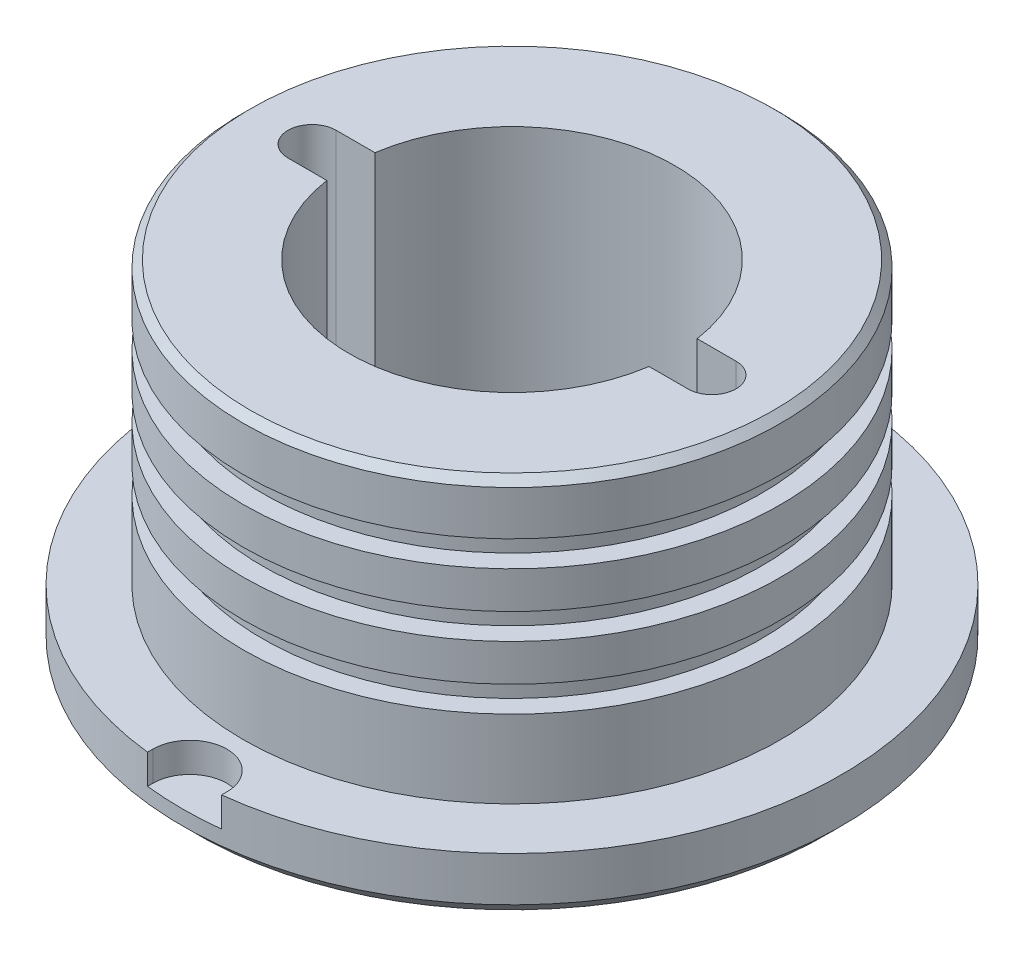
ISO-10303-21;
HEADER;
FILE_DESCRIPTION(('STEP AP214'),'2;1');
FILE_NAME('part.step','',(''),(''),'','','');
FILE_SCHEMA(('AUTOMOTIVE_DESIGN { 1 0 10303 214 1 1 1 1 }'));
ENDSEC;
DATA;
#1=APPLICATION_CONTEXT('core data for automotive mechanical design processes');
#2=APPLICATION_PROTOCOL_DEFINITION('international standard','automotive_design',2000,#1);
#3=PRODUCT_CONTEXT('',#1,'mechanical');
#4=PRODUCT('Part','Part','',(#3));
#5=PRODUCT_RELATED_PRODUCT_CATEGORY('part','',(#4));
#6=PRODUCT_DEFINITION_FORMATION('','',#4);
#7=PRODUCT_DEFINITION_CONTEXT('part definition',#1,'design');
#8=PRODUCT_DEFINITION('design','',#6,#7);
#9=PRODUCT_DEFINITION_SHAPE('','',#8);
#10=(LENGTH_UNIT() NAMED_UNIT(*) SI_UNIT(.MILLI.,.METRE.));
#11=(NAMED_UNIT(*) PLANE_ANGLE_UNIT() SI_UNIT($,.RADIAN.));
#12=(NAMED_UNIT(*) SI_UNIT($,.STERADIAN.) SOLID_ANGLE_UNIT());
#13=UNCERTAINTY_MEASURE_WITH_UNIT(LENGTH_MEASURE(1.E-05),#10,'distance_accuracy_value','');
#14=(GEOMETRIC_REPRESENTATION_CONTEXT(3) GLOBAL_UNCERTAINTY_ASSIGNED_CONTEXT((#13)) GLOBAL_UNIT_ASSIGNED_CONTEXT((#10,
#11,#12)) REPRESENTATION_CONTEXT('',''));
#15=CARTESIAN_POINT('',(0.,0.,0.));
#16=DIRECTION('',(0.,0.,1.));
#17=DIRECTION('',(1.,0.,0.));
#18=AXIS2_PLACEMENT_3D('',#15,#16,#17);
#19=CARTESIAN_POINT('',(0.,0.,0.));
#20=DIRECTION('',(0.,-1.,0.));
#21=DIRECTION('',(0.,0.,-1.));
#22=AXIS2_PLACEMENT_3D('',#19,#20,#21);
#23=CYLINDRICAL_SURFACE('',#22,22.);
#24=CARTESIAN_POINT('',(0.,46.,0.));
#25=DIRECTION('',(0.,-1.,0.));
#26=DIRECTION('',(0.,0.,-1.));
#27=AXIS2_PLACEMENT_3D('',#24,#25,#26);
#28=CIRCLE('',#27,22.);
#29=CARTESIAN_POINT('',(-21.7586189819115,46.,-3.25));
#30=VERTEX_POINT('',#29);
#31=CARTESIAN_POINT('',(21.7586189819115,46.,-3.25));
#32=VERTEX_POINT('',#31);
#33=EDGE_CURVE('E380',#30,#32,#28,.T.);
#34=ORIENTED_EDGE('',*,*,#33,.F.);
#35=DIRECTION('',(0.,-1.,0.));
#36=VECTOR('',#35,1.);
#37=CARTESIAN_POINT('',(-21.7586189819115,0.,-3.25));
#38=LINE('',#37,#36);
#39=CARTESIAN_POINT('',(-21.7586189819115,12.0000000000002,-3.25));
#40=VERTEX_POINT('',#39);
#41=EDGE_CURVE('E239',#30,#40,#38,.T.);
#42=ORIENTED_EDGE('',*,*,#41,.T.);
#43=CARTESIAN_POINT('',(0.,12.0000000000002,0.));
#44=DIRECTION('',(0.,-1.,0.));
#45=DIRECTION('',(0.,0.,-1.));
#46=AXIS2_PLACEMENT_3D('',#43,#44,#45);
#47=CIRCLE('',#46,22.);
#48=CARTESIAN_POINT('',(21.7586189819115,12.0000000000002,-3.25));
#49=VERTEX_POINT('',#48);
#50=EDGE_CURVE('E375',#40,#49,#47,.T.);
#51=ORIENTED_EDGE('',*,*,#50,.T.);
#52=DIRECTION('',(0.,-1.,0.));
#53=VECTOR('',#52,1.);
#54=CARTESIAN_POINT('',(21.7586189819115,0.,-3.25));
#55=LINE('',#54,#53);
#56=EDGE_CURVE('E236',#32,#49,#55,.T.);
#57=ORIENTED_EDGE('',*,*,#56,.F.);
#58=EDGE_LOOP('',(#34,#42,#51,#57));
#59=FACE_BOUND('',#58,.T.);
#60=ADVANCED_FACE('F45',(#59),#23,.F.);
#61=CARTESIAN_POINT('',(0.,0.,0.));
#62=DIRECTION('',(0.,-1.,0.));
#63=DIRECTION('',(0.,0.,-1.));
#64=AXIS2_PLACEMENT_3D('',#61,#62,#63);
#65=PLANE('',#64);
#66=CARTESIAN_POINT('',(0.,0.,-13.));
#67=DIRECTION('',(0.,-1.,0.));
#68=DIRECTION('',(0.,0.,-1.));
#69=AXIS2_PLACEMENT_3D('',#66,#67,#68);
#70=CIRCLE('',#69,4.);
#71=CARTESIAN_POINT('',(0.,0.,-17.));
#72=VERTEX_POINT('',#71);
#73=EDGE_CURVE('E902',#72,#72,#70,.T.);
#74=ORIENTED_EDGE('',*,*,#73,.F.);
#75=EDGE_LOOP('',(#74));
#76=FACE_BOUND('',#75,.T.);
#77=CARTESIAN_POINT('',(-8.49999999999999,0.,7.));
#78=DIRECTION('',(0.,-1.,0.));
#79=DIRECTION('',(0.,0.,-1.));
#80=AXIS2_PLACEMENT_3D('',#77,#78,#79);
#81=CIRCLE('',#80,1.25);
#82=CARTESIAN_POINT('',(-8.49999999999999,0.,5.75));
#83=VERTEX_POINT('',#82);
#84=EDGE_CURVE('E914',#83,#83,#81,.T.);
#85=ORIENTED_EDGE('',*,*,#84,.F.);
#86=EDGE_LOOP('',(#85));
#87=FACE_BOUND('',#86,.T.);
#88=CARTESIAN_POINT('',(8.50000000000001,0.,7.));
#89=DIRECTION('',(0.,-1.,0.));
#90=DIRECTION('',(0.,0.,-1.));
#91=AXIS2_PLACEMENT_3D('',#88,#89,#90);
#92=CIRCLE('',#91,1.25);
#93=CARTESIAN_POINT('',(8.50000000000001,0.,5.75));
#94=VERTEX_POINT('',#93);
#95=EDGE_CURVE('E194',#94,#94,#92,.T.);
#96=ORIENTED_EDGE('',*,*,#95,.F.);
#97=EDGE_LOOP('',(#96));
#98=FACE_BOUND('',#97,.T.);
#99=CARTESIAN_POINT('',(0.,0.,0.));
#100=DIRECTION('',(0.,-1.,0.));
#101=DIRECTION('',(0.,0.,-1.));
#102=AXIS2_PLACEMENT_3D('',#99,#100,#101);
#103=CIRCLE('',#102,42.5);
#104=CARTESIAN_POINT('',(0.,0.,-42.5));
#105=VERTEX_POINT('',#104);
#106=EDGE_CURVE('E55',#105,#105,#103,.T.);
#107=ORIENTED_EDGE('',*,*,#106,.T.);
#108=EDGE_LOOP('',(#107));
#109=FACE_BOUND('',#108,.T.);
#110=CARTESIAN_POINT('',(27.,0.,0.));
#111=DIRECTION('',(0.,-1.,0.));
#112=DIRECTION('',(0.,0.,-1.));
#113=AXIS2_PLACEMENT_3D('',#110,#111,#112);
#114=CIRCLE('',#113,1.5);
#115=CARTESIAN_POINT('',(27.,0.,-1.5));
#116=VERTEX_POINT('',#115);
#117=EDGE_CURVE('E251',#116,#116,#114,.F.);
#118=ORIENTED_EDGE('',*,*,#117,.T.);
#119=EDGE_LOOP('',(#118));
#120=FACE_BOUND('',#119,.T.);
#121=CARTESIAN_POINT('',(-27.,0.,0.));
#122=DIRECTION('',(0.,-1.,0.));
#123=DIRECTION('',(0.,0.,-1.));
#124=AXIS2_PLACEMENT_3D('',#121,#122,#123);
#125=CIRCLE('',#124,1.5);
#126=CARTESIAN_POINT('',(-27.,0.,-1.5));
#127=VERTEX_POINT('',#126);
#128=EDGE_CURVE('E299',#127,#127,#125,.T.);
#129=ORIENTED_EDGE('',*,*,#128,.F.);
#130=EDGE_LOOP('',(#129));
#131=FACE_BOUND('',#130,.T.);
#132=ADVANCED_FACE('F414',(#76,#87,#98,#109,#120,#131),#65,.T.);
#133=CARTESIAN_POINT('',(0.,0.,0.));
#134=DIRECTION('',(0.,-1.,0.));
#135=DIRECTION('',(0.,0.,-1.));
#136=AXIS2_PLACEMENT_3D('',#133,#134,#135);
#137=CYLINDRICAL_SURFACE('',#136,36.3);
#138=CARTESIAN_POINT('',(0.,45.,0.));
#139=DIRECTION('',(0.,1.,0.));
#140=DIRECTION('',(0.,0.,1.));
#141=AXIS2_PLACEMENT_3D('',#138,#139,#140);
#142=CIRCLE('',#141,36.3);
#143=CARTESIAN_POINT('',(0.,45.,36.3));
#144=VERTEX_POINT('',#143);
#145=EDGE_CURVE('E397',#144,#144,#142,.F.);
#146=ORIENTED_EDGE('',*,*,#145,.T.);
#147=EDGE_LOOP('',(#146));
#148=FACE_BOUND('',#147,.T.);
#149=CARTESIAN_POINT('',(0.,39.,0.));
#150=DIRECTION('',(0.,-1.,0.));
#151=DIRECTION('',(0.,0.,-1.));
#152=AXIS2_PLACEMENT_3D('',#149,#150,#151);
#153=CIRCLE('',#152,36.3);
#154=CARTESIAN_POINT('',(0.,39.,-36.3));
#155=VERTEX_POINT('',#154);
#156=EDGE_CURVE('E318',#155,#155,#153,.T.);
#157=ORIENTED_EDGE('',*,*,#156,.F.);
#158=EDGE_LOOP('',(#157));
#159=FACE_BOUND('',#158,.T.);
#160=ADVANCED_FACE('F437',(#148,#159),#137,.T.);
#161=CARTESIAN_POINT('',(36.3,46.,0.));
#162=DIRECTION('',(0.,1.,0.));
#163=DIRECTION('',(0.,0.,1.));
#164=AXIS2_PLACEMENT_3D('',#161,#162,#163);
#165=PLANE('',#164);
#166=DIRECTION('',(-1.,0.,0.));
#167=VECTOR('',#166,1.);
#168=CARTESIAN_POINT('',(22.,46.,3.24999999999997));
#169=LINE('',#168,#167);
#170=CARTESIAN_POINT('',(-21.7586189819115,46.,3.25));
#171=VERTEX_POINT('',#170);
#172=CARTESIAN_POINT('',(-27.,46.,3.25));
#173=VERTEX_POINT('',#172);
#174=EDGE_CURVE('E174',#171,#173,#169,.T.);
#175=ORIENTED_EDGE('',*,*,#174,.T.);
#176=CARTESIAN_POINT('',(-27.,46.,0.));
#177=DIRECTION('',(0.,1.,0.));
#178=DIRECTION('',(0.,0.,1.));
#179=AXIS2_PLACEMENT_3D('',#176,#177,#178);
#180=CIRCLE('',#179,3.25);
#181=CARTESIAN_POINT('',(-27.,46.,-3.25));
#182=VERTEX_POINT('',#181);
#183=EDGE_CURVE('E162',#182,#173,#180,.T.);
#184=ORIENTED_EDGE('',*,*,#183,.F.);
#185=DIRECTION('',(-1.,0.,0.));
#186=VECTOR('',#185,1.);
#187=CARTESIAN_POINT('',(22.,46.,-3.24999999999998));
#188=LINE('',#187,#186);
#189=EDGE_CURVE('E173',#30,#182,#188,.T.);
#190=ORIENTED_EDGE('',*,*,#189,.F.);
#191=ORIENTED_EDGE('',*,*,#33,.T.);
#192=DIRECTION('',(1.,0.,0.));
#193=VECTOR('',#192,1.);
#194=CARTESIAN_POINT('',(22.,46.,-3.25));
#195=LINE('',#194,#193);
#196=CARTESIAN_POINT('',(27.,46.,-3.25));
#197=VERTEX_POINT('',#196);
#198=EDGE_CURVE('E210',#32,#197,#195,.T.);
#199=ORIENTED_EDGE('',*,*,#198,.T.);
#200=CARTESIAN_POINT('',(27.,46.,0.));
#201=DIRECTION('',(0.,1.,0.));
#202=DIRECTION('',(0.,0.,1.));
#203=AXIS2_PLACEMENT_3D('',#200,#201,#202);
#204=CIRCLE('',#203,3.25);
#205=CARTESIAN_POINT('',(27.,46.,3.25));
#206=VERTEX_POINT('',#205);
#207=EDGE_CURVE('E207',#206,#197,#204,.T.);
#208=ORIENTED_EDGE('',*,*,#207,.F.);
#209=DIRECTION('',(1.,0.,0.));
#210=VECTOR('',#209,1.);
#211=CARTESIAN_POINT('',(22.,46.,3.25));
#212=LINE('',#211,#210);
#213=CARTESIAN_POINT('',(21.7586189819115,46.,3.25));
#214=VERTEX_POINT('',#213);
#215=EDGE_CURVE('E215',#214,#206,#212,.T.);
#216=ORIENTED_EDGE('',*,*,#215,.F.);
#217=EDGE_CURVE('E186',#214,#171,#28,.T.);
#218=ORIENTED_EDGE('',*,*,#217,.T.);
#219=EDGE_LOOP('',(#175,#184,#190,#191,#199,#208,#216,#218));
#220=FACE_BOUND('',#219,.T.);
#221=CARTESIAN_POINT('',(0.,46.,0.));
#222=DIRECTION('',(0.,1.,0.));
#223=DIRECTION('',(0.,0.,1.));
#224=AXIS2_PLACEMENT_3D('',#221,#222,#223);
#225=CIRCLE('',#224,35.3);
#226=CARTESIAN_POINT('',(0.,46.,35.3));
#227=VERTEX_POINT('',#226);
#228=EDGE_CURVE('E401',#227,#227,#225,.T.);
#229=ORIENTED_EDGE('',*,*,#228,.T.);
#230=EDGE_LOOP('',(#229));
#231=FACE_BOUND('',#230,.T.);
#232=ADVANCED_FACE('F182',(#220,#231),#165,.T.);
#233=DIRECTION('',(0.,-1.,0.));
#234=VECTOR('',#233,1.);
#235=CARTESIAN_POINT('',(-21.7586189819115,0.,3.25));
#236=LINE('',#235,#234);
#237=CARTESIAN_POINT('',(-21.7586189819115,12.0000000000002,3.25));
#238=VERTEX_POINT('',#237);
#239=EDGE_CURVE('E243',#171,#238,#236,.T.);
#240=ORIENTED_EDGE('',*,*,#239,.F.);
#241=ORIENTED_EDGE('',*,*,#217,.F.);
#242=DIRECTION('',(0.,-1.,0.));
#243=VECTOR('',#242,1.);
#244=CARTESIAN_POINT('',(21.7586189819115,0.,3.25));
#245=LINE('',#244,#243);
#246=CARTESIAN_POINT('',(21.7586189819115,12.0000000000002,3.25));
#247=VERTEX_POINT('',#246);
#248=EDGE_CURVE('E205',#214,#247,#245,.T.);
#249=ORIENTED_EDGE('',*,*,#248,.T.);
#250=EDGE_CURVE('E379',#247,#238,#47,.T.);
#251=ORIENTED_EDGE('',*,*,#250,.T.);
#252=EDGE_LOOP('',(#240,#241,#249,#251));
#253=FACE_BOUND('',#252,.T.);
#254=ADVANCED_FACE('F433',(#253),#23,.F.);
#255=CARTESIAN_POINT('',(22.,12.0000000000002,0.));
#256=DIRECTION('',(0.,1.,0.));
#257=DIRECTION('',(0.,0.,1.));
#258=AXIS2_PLACEMENT_3D('',#255,#256,#257);
#259=PLANE('',#258);
#260=CARTESIAN_POINT('',(0.,12.0000000000002,-13.));
#261=DIRECTION('',(0.,1.,0.));
#262=DIRECTION('',(0.,0.,1.));
#263=AXIS2_PLACEMENT_3D('',#260,#261,#262);
#264=CIRCLE('',#263,4.);
#265=CARTESIAN_POINT('',(0.,12.0000000000002,-9.));
#266=VERTEX_POINT('',#265);
#267=EDGE_CURVE('E899',#266,#266,#264,.F.);
#268=ORIENTED_EDGE('',*,*,#267,.T.);
#269=EDGE_LOOP('',(#268));
#270=FACE_BOUND('',#269,.T.);
#271=ORIENTED_EDGE('',*,*,#50,.F.);
#272=DIRECTION('',(-1.,0.,0.));
#273=VECTOR('',#272,1.);
#274=CARTESIAN_POINT('',(22.,12.0000000000002,-3.24999999999998));
#275=LINE('',#274,#273);
#276=CARTESIAN_POINT('',(-27.,12.0000000000002,-3.25));
#277=VERTEX_POINT('',#276);
#278=EDGE_CURVE('E188',#40,#277,#275,.T.);
#279=ORIENTED_EDGE('',*,*,#278,.T.);
#280=CARTESIAN_POINT('',(-27.,12.0000000000002,0.));
#281=DIRECTION('',(0.,1.,0.));
#282=DIRECTION('',(0.,0.,1.));
#283=AXIS2_PLACEMENT_3D('',#280,#281,#282);
#284=CIRCLE('',#283,3.25);
#285=CARTESIAN_POINT('',(-27.,12.0000000000002,3.25));
#286=VERTEX_POINT('',#285);
#287=EDGE_CURVE('E191',#277,#286,#284,.T.);
#288=ORIENTED_EDGE('',*,*,#287,.T.);
#289=DIRECTION('',(-1.,0.,0.));
#290=VECTOR('',#289,1.);
#291=CARTESIAN_POINT('',(22.,12.0000000000002,3.24999999999997));
#292=LINE('',#291,#290);
#293=EDGE_CURVE('E62',#238,#286,#292,.T.);
#294=ORIENTED_EDGE('',*,*,#293,.F.);
#295=ORIENTED_EDGE('',*,*,#250,.F.);
#296=DIRECTION('',(1.,0.,0.));
#297=VECTOR('',#296,1.);
#298=CARTESIAN_POINT('',(22.,12.0000000000002,3.25));
#299=LINE('',#298,#297);
#300=CARTESIAN_POINT('',(27.,12.0000000000002,3.25));
#301=VERTEX_POINT('',#300);
#302=EDGE_CURVE('E211',#247,#301,#299,.T.);
#303=ORIENTED_EDGE('',*,*,#302,.T.);
#304=CARTESIAN_POINT('',(27.,12.0000000000002,0.));
#305=DIRECTION('',(0.,1.,0.));
#306=DIRECTION('',(0.,0.,1.));
#307=AXIS2_PLACEMENT_3D('',#304,#305,#306);
#308=CIRCLE('',#307,3.25);
#309=CARTESIAN_POINT('',(27.,12.0000000000002,-3.25));
#310=VERTEX_POINT('',#309);
#311=EDGE_CURVE('E219',#301,#310,#308,.T.);
#312=ORIENTED_EDGE('',*,*,#311,.T.);
#313=DIRECTION('',(1.,0.,0.));
#314=VECTOR('',#313,1.);
#315=CARTESIAN_POINT('',(22.,12.0000000000002,-3.25));
#316=LINE('',#315,#314);
#317=EDGE_CURVE('E69',#49,#310,#316,.T.);
#318=ORIENTED_EDGE('',*,*,#317,.F.);
#319=EDGE_LOOP('',(#271,#279,#288,#294,#295,#303,#312,#318));
#320=FACE_BOUND('',#319,.T.);
#321=CARTESIAN_POINT('',(27.,12.0000000000002,0.));
#322=DIRECTION('',(0.,1.,0.));
#323=DIRECTION('',(0.,0.,1.));
#324=AXIS2_PLACEMENT_3D('',#321,#322,#323);
#325=CIRCLE('',#324,1.5);
#326=CARTESIAN_POINT('',(27.,12.0000000000002,1.5));
#327=VERTEX_POINT('',#326);
#328=EDGE_CURVE('E246',#327,#327,#325,.T.);
#329=ORIENTED_EDGE('',*,*,#328,.F.);
#330=EDGE_LOOP('',(#329));
#331=FACE_BOUND('',#330,.T.);
#332=CARTESIAN_POINT('',(-27.,12.0000000000002,0.));
#333=DIRECTION('',(0.,1.,0.));
#334=DIRECTION('',(0.,0.,1.));
#335=AXIS2_PLACEMENT_3D('',#332,#333,#334);
#336=CIRCLE('',#335,1.5);
#337=CARTESIAN_POINT('',(-27.,12.0000000000002,1.5));
#338=VERTEX_POINT('',#337);
#339=EDGE_CURVE('E247',#338,#338,#336,.F.);
#340=ORIENTED_EDGE('',*,*,#339,.T.);
#341=EDGE_LOOP('',(#340));
#342=FACE_BOUND('',#341,.T.);
#343=ADVANCED_FACE('F444',(#270,#320,#331,#342),#259,.T.);
#344=CARTESIAN_POINT('',(0.,0.,0.));
#345=DIRECTION('',(0.,-1.,0.));
#346=DIRECTION('',(0.,0.,-1.));
#347=AXIS2_PLACEMENT_3D('',#344,#345,#346);
#348=CYLINDRICAL_SURFACE('',#347,44.5);
#349=CARTESIAN_POINT('',(0.,1.99999999999997,0.));
#350=DIRECTION('',(0.,-1.,0.));
#351=DIRECTION('',(0.,0.,-1.));
#352=AXIS2_PLACEMENT_3D('',#349,#350,#351);
#353=CIRCLE('',#352,44.5);
#354=CARTESIAN_POINT('',(0.,1.99999999999997,-44.5));
#355=VERTEX_POINT('',#354);
#356=EDGE_CURVE('E11',#355,#355,#353,.F.);
#357=ORIENTED_EDGE('',*,*,#356,.T.);
#358=EDGE_LOOP('',(#357));
#359=FACE_BOUND('',#358,.T.);
#360=DIRECTION('',(0.,-1.,0.));
#361=VECTOR('',#360,1.);
#362=CARTESIAN_POINT('',(4.99999999999996,0.,-44.218208918951));
#363=LINE('',#362,#361);
#364=CARTESIAN_POINT('',(4.99999999999996,8.,-44.218208918951));
#365=VERTEX_POINT('',#364);
#366=CARTESIAN_POINT('',(4.99999999999996,4.,-44.218208918951));
#367=VERTEX_POINT('',#366);
#368=EDGE_CURVE('E315',#365,#367,#363,.T.);
#369=ORIENTED_EDGE('',*,*,#368,.F.);
#370=CARTESIAN_POINT('',(0.,8.,0.));
#371=DIRECTION('',(0.,-1.,0.));
#372=DIRECTION('',(0.,0.,-1.));
#373=AXIS2_PLACEMENT_3D('',#370,#371,#372);
#374=CIRCLE('',#373,44.5);
#375=CARTESIAN_POINT('',(4.99999999999996,8.,44.218208918951));
#376=VERTEX_POINT('',#375);
#377=EDGE_CURVE('E371',#365,#376,#374,.T.);
#378=ORIENTED_EDGE('',*,*,#377,.T.);
#379=DIRECTION('',(0.,-1.,0.));
#380=VECTOR('',#379,1.);
#381=CARTESIAN_POINT('',(4.99999999999996,0.,44.218208918951));
#382=LINE('',#381,#380);
#383=CARTESIAN_POINT('',(4.99999999999996,4.,44.218208918951));
#384=VERTEX_POINT('',#383);
#385=EDGE_CURVE('E278',#384,#376,#382,.F.);
#386=ORIENTED_EDGE('',*,*,#385,.F.);
#387=CARTESIAN_POINT('',(0.,4.,0.));
#388=DIRECTION('',(0.,-1.,0.));
#389=DIRECTION('',(0.,0.,-1.));
#390=AXIS2_PLACEMENT_3D('',#387,#388,#389);
#391=CIRCLE('',#390,44.5);
#392=CARTESIAN_POINT('',(-4.99999999999999,4.,44.218208918951));
#393=VERTEX_POINT('',#392);
#394=EDGE_CURVE('E390',#393,#384,#391,.F.);
#395=ORIENTED_EDGE('',*,*,#394,.F.);
#396=DIRECTION('',(0.,-1.,0.));
#397=VECTOR('',#396,1.);
#398=CARTESIAN_POINT('',(-4.99999999999999,0.,44.218208918951));
#399=LINE('',#398,#397);
#400=CARTESIAN_POINT('',(-4.99999999999999,8.,44.218208918951));
#401=VERTEX_POINT('',#400);
#402=EDGE_CURVE('E309',#401,#393,#399,.T.);
#403=ORIENTED_EDGE('',*,*,#402,.F.);
#404=CARTESIAN_POINT('',(-5.,8.,-44.218208918951));
#405=VERTEX_POINT('',#404);
#406=EDGE_CURVE('E370',#401,#405,#374,.T.);
#407=ORIENTED_EDGE('',*,*,#406,.T.);
#408=DIRECTION('',(0.,-1.,0.));
#409=VECTOR('',#408,1.);
#410=CARTESIAN_POINT('',(-4.99999999999999,0.,-44.218208918951));
#411=LINE('',#410,#409);
#412=CARTESIAN_POINT('',(-4.99999999999999,4.,-44.218208918951));
#413=VERTEX_POINT('',#412);
#414=EDGE_CURVE('E312',#413,#405,#411,.F.);
#415=ORIENTED_EDGE('',*,*,#414,.F.);
#416=CARTESIAN_POINT('',(0.,4.,0.));
#417=DIRECTION('',(0.,1.,0.));
#418=DIRECTION('',(0.,0.,1.));
#419=AXIS2_PLACEMENT_3D('',#416,#417,#418);
#420=CIRCLE('',#419,44.5);
#421=EDGE_CURVE('E393',#413,#367,#420,.F.);
#422=ORIENTED_EDGE('',*,*,#421,.T.);
#423=EDGE_LOOP('',(#369,#378,#386,#395,#403,#407,#415,#422));
#424=FACE_BOUND('',#423,.T.);
#425=ADVANCED_FACE('F450',(#359,#424),#348,.T.);
#426=CARTESIAN_POINT('',(44.5,8.,0.));
#427=DIRECTION('',(0.,1.,0.));
#428=DIRECTION('',(0.,0.,1.));
#429=AXIS2_PLACEMENT_3D('',#426,#427,#428);
#430=PLANE('',#429);
#431=DIRECTION('',(0.,0.,-1.));
#432=VECTOR('',#431,1.);
#433=CARTESIAN_POINT('',(4.99999999999996,8.,-45.5));
#434=LINE('',#433,#432);
#435=CARTESIAN_POINT('',(4.99999999999996,8.,-43.5));
#436=VERTEX_POINT('',#435);
#437=EDGE_CURVE('E259',#436,#365,#434,.T.);
#438=ORIENTED_EDGE('',*,*,#437,.F.);
#439=CARTESIAN_POINT('',(0.,8.,-43.5));
#440=DIRECTION('',(0.,1.,0.));
#441=DIRECTION('',(0.,0.,1.));
#442=AXIS2_PLACEMENT_3D('',#439,#440,#441);
#443=CIRCLE('',#442,4.99999999999998);
#444=CARTESIAN_POINT('',(-5.,8.,-43.5));
#445=VERTEX_POINT('',#444);
#446=EDGE_CURVE('E268',#445,#436,#443,.T.);
#447=ORIENTED_EDGE('',*,*,#446,.F.);
#448=DIRECTION('',(0.,0.,1.));
#449=VECTOR('',#448,1.);
#450=CARTESIAN_POINT('',(-4.99999999999998,8.,0.));
#451=LINE('',#450,#449);
#452=EDGE_CURVE('E387',#405,#445,#451,.T.);
#453=ORIENTED_EDGE('',*,*,#452,.F.);
#454=ORIENTED_EDGE('',*,*,#406,.F.);
#455=DIRECTION('',(0.,0.,1.));
#456=VECTOR('',#455,1.);
#457=CARTESIAN_POINT('',(-5.,8.,45.5));
#458=LINE('',#457,#456);
#459=CARTESIAN_POINT('',(-5.,8.,43.5));
#460=VERTEX_POINT('',#459);
#461=EDGE_CURVE('E286',#460,#401,#458,.T.);
#462=ORIENTED_EDGE('',*,*,#461,.F.);
#463=CARTESIAN_POINT('',(0.,8.,43.5));
#464=DIRECTION('',(0.,1.,0.));
#465=DIRECTION('',(0.,0.,-1.));
#466=AXIS2_PLACEMENT_3D('',#463,#464,#465);
#467=CIRCLE('',#466,4.99999999999998);
#468=CARTESIAN_POINT('',(4.99999999999996,8.,43.5));
#469=VERTEX_POINT('',#468);
#470=EDGE_CURVE('E295',#469,#460,#467,.T.);
#471=ORIENTED_EDGE('',*,*,#470,.F.);
#472=DIRECTION('',(0.,0.,-1.));
#473=VECTOR('',#472,1.);
#474=CARTESIAN_POINT('',(4.99999999999998,8.,0.));
#475=LINE('',#474,#473);
#476=EDGE_CURVE('E384',#376,#469,#475,.T.);
#477=ORIENTED_EDGE('',*,*,#476,.F.);
#478=ORIENTED_EDGE('',*,*,#377,.F.);
#479=EDGE_LOOP('',(#438,#447,#453,#454,#462,#471,#477,#478));
#480=FACE_BOUND('',#479,.T.);
#481=CARTESIAN_POINT('',(0.,8.,0.));
#482=DIRECTION('',(0.,-1.,0.));
#483=DIRECTION('',(0.,0.,-1.));
#484=AXIS2_PLACEMENT_3D('',#481,#482,#483);
#485=CIRCLE('',#484,36.300000000035);
#486=CARTESIAN_POINT('',(0.,8.,-36.300000000035));
#487=VERTEX_POINT('',#486);
#488=EDGE_CURVE('E366',#487,#487,#485,.T.);
#489=ORIENTED_EDGE('',*,*,#488,.T.);
#490=EDGE_LOOP('',(#489));
#491=FACE_BOUND('',#490,.T.);
#492=ADVANCED_FACE('F467',(#480,#491),#430,.T.);
#493=CARTESIAN_POINT('',(0.,0.,0.));
#494=DIRECTION('',(0.,-1.,0.));
#495=DIRECTION('',(0.,0.,-1.));
#496=AXIS2_PLACEMENT_3D('',#493,#494,#495);
#497=CYLINDRICAL_SURFACE('',#496,36.3000000000175);
#498=CARTESIAN_POINT('',(0.,18.5,0.));
#499=DIRECTION('',(0.,-1.,0.));
#500=DIRECTION('',(0.,0.,-1.));
#501=AXIS2_PLACEMENT_3D('',#498,#499,#500);
#502=CIRCLE('',#501,36.3);
#503=CARTESIAN_POINT('',(0.,18.5,-36.3));
#504=VERTEX_POINT('',#503);
#505=EDGE_CURVE('E362',#504,#504,#502,.T.);
#506=ORIENTED_EDGE('',*,*,#505,.T.);
#507=EDGE_LOOP('',(#506));
#508=FACE_BOUND('',#507,.T.);
#509=ORIENTED_EDGE('',*,*,#488,.F.);
#510=EDGE_LOOP('',(#509));
#511=FACE_BOUND('',#510,.T.);
#512=ADVANCED_FACE('F552',(#508,#511),#497,.T.);
#513=CARTESIAN_POINT('',(36.3,18.5,0.));
#514=DIRECTION('',(0.,1.,0.));
#515=DIRECTION('',(0.,0.,1.));
#516=AXIS2_PLACEMENT_3D('',#513,#514,#515);
#517=PLANE('',#516);
#518=CARTESIAN_POINT('',(0.,18.5,0.));
#519=DIRECTION('',(0.,-1.,0.));
#520=DIRECTION('',(0.,0.,-1.));
#521=AXIS2_PLACEMENT_3D('',#518,#519,#520);
#522=CIRCLE('',#521,33.7);
#523=CARTESIAN_POINT('',(0.,18.5,-33.7));
#524=VERTEX_POINT('',#523);
#525=EDGE_CURVE('E358',#524,#524,#522,.T.);
#526=ORIENTED_EDGE('',*,*,#525,.T.);
#527=EDGE_LOOP('',(#526));
#528=FACE_BOUND('',#527,.T.);
#529=ORIENTED_EDGE('',*,*,#505,.F.);
#530=EDGE_LOOP('',(#529));
#531=FACE_BOUND('',#530,.T.);
#532=ADVANCED_FACE('F548',(#528,#531),#517,.T.);
#533=CARTESIAN_POINT('',(0.,0.,0.));
#534=DIRECTION('',(0.,-1.,0.));
#535=DIRECTION('',(0.,0.,-1.));
#536=AXIS2_PLACEMENT_3D('',#533,#534,#535);
#537=CYLINDRICAL_SURFACE('',#536,33.7);
#538=CARTESIAN_POINT('',(0.,22.,0.));
#539=DIRECTION('',(0.,-1.,0.));
#540=DIRECTION('',(0.,0.,-1.));
#541=AXIS2_PLACEMENT_3D('',#538,#539,#540);
#542=CIRCLE('',#541,33.7);
#543=CARTESIAN_POINT('',(0.,22.,-33.7));
#544=VERTEX_POINT('',#543);
#545=EDGE_CURVE('E354',#544,#544,#542,.T.);
#546=ORIENTED_EDGE('',*,*,#545,.T.);
#547=EDGE_LOOP('',(#546));
#548=FACE_BOUND('',#547,.T.);
#549=ORIENTED_EDGE('',*,*,#525,.F.);
#550=EDGE_LOOP('',(#549));
#551=FACE_BOUND('',#550,.T.);
#552=ADVANCED_FACE('F544',(#548,#551),#537,.T.);
#553=CARTESIAN_POINT('',(33.7,22.,0.));
#554=DIRECTION('',(0.,-1.,0.));
#555=DIRECTION('',(0.,0.,-1.));
#556=AXIS2_PLACEMENT_3D('',#553,#554,#555);
#557=PLANE('',#556);
#558=CARTESIAN_POINT('',(0.,22.,0.));
#559=DIRECTION('',(0.,-1.,0.));
#560=DIRECTION('',(0.,0.,-1.));
#561=AXIS2_PLACEMENT_3D('',#558,#559,#560);
#562=CIRCLE('',#561,36.3);
#563=CARTESIAN_POINT('',(0.,22.,-36.3));
#564=VERTEX_POINT('',#563);
#565=EDGE_CURVE('E350',#564,#564,#562,.T.);
#566=ORIENTED_EDGE('',*,*,#565,.T.);
#567=EDGE_LOOP('',(#566));
#568=FACE_BOUND('',#567,.T.);
#569=ORIENTED_EDGE('',*,*,#545,.F.);
#570=EDGE_LOOP('',(#569));
#571=FACE_BOUND('',#570,.T.);
#572=ADVANCED_FACE('F540',(#568,#571),#557,.T.);
#573=CARTESIAN_POINT('',(0.,0.,0.));
#574=DIRECTION('',(0.,-1.,0.));
#575=DIRECTION('',(0.,0.,-1.));
#576=AXIS2_PLACEMENT_3D('',#573,#574,#575);
#577=CYLINDRICAL_SURFACE('',#576,36.3);
#578=CARTESIAN_POINT('',(0.,27.,0.));
#579=DIRECTION('',(0.,-1.,0.));
#580=DIRECTION('',(0.,0.,-1.));
#581=AXIS2_PLACEMENT_3D('',#578,#579,#580);
#582=CIRCLE('',#581,36.3);
#583=CARTESIAN_POINT('',(0.,27.,-36.3));
#584=VERTEX_POINT('',#583);
#585=EDGE_CURVE('E346',#584,#584,#582,.T.);
#586=ORIENTED_EDGE('',*,*,#585,.T.);
#587=EDGE_LOOP('',(#586));
#588=FACE_BOUND('',#587,.T.);
#589=ORIENTED_EDGE('',*,*,#565,.F.);
#590=EDGE_LOOP('',(#589));
#591=FACE_BOUND('',#590,.T.);
#592=ADVANCED_FACE('F536',(#588,#591),#577,.T.);
#593=CARTESIAN_POINT('',(36.3,27.,0.));
#594=DIRECTION('',(0.,1.,0.));
#595=DIRECTION('',(0.,0.,1.));
#596=AXIS2_PLACEMENT_3D('',#593,#594,#595);
#597=PLANE('',#596);
#598=CARTESIAN_POINT('',(0.,27.,0.));
#599=DIRECTION('',(0.,-1.,0.));
#600=DIRECTION('',(0.,0.,-1.));
#601=AXIS2_PLACEMENT_3D('',#598,#599,#600);
#602=CIRCLE('',#601,33.7);
#603=CARTESIAN_POINT('',(0.,27.,-33.7));
#604=VERTEX_POINT('',#603);
#605=EDGE_CURVE('E342',#604,#604,#602,.T.);
#606=ORIENTED_EDGE('',*,*,#605,.T.);
#607=EDGE_LOOP('',(#606));
#608=FACE_BOUND('',#607,.T.);
#609=ORIENTED_EDGE('',*,*,#585,.F.);
#610=EDGE_LOOP('',(#609));
#611=FACE_BOUND('',#610,.T.);
#612=ADVANCED_FACE('F532',(#608,#611),#597,.T.);
#613=CARTESIAN_POINT('',(0.,0.,0.));
#614=DIRECTION('',(0.,-1.,0.));
#615=DIRECTION('',(0.,0.,-1.));
#616=AXIS2_PLACEMENT_3D('',#613,#614,#615);
#617=CYLINDRICAL_SURFACE('',#616,33.7);
#618=CARTESIAN_POINT('',(0.,30.5,0.));
#619=DIRECTION('',(0.,-1.,0.));
#620=DIRECTION('',(0.,0.,-1.));
#621=AXIS2_PLACEMENT_3D('',#618,#619,#620);
#622=CIRCLE('',#621,33.7);
#623=CARTESIAN_POINT('',(0.,30.5,-33.7));
#624=VERTEX_POINT('',#623);
#625=EDGE_CURVE('E338',#624,#624,#622,.T.);
#626=ORIENTED_EDGE('',*,*,#625,.T.);
#627=EDGE_LOOP('',(#626));
#628=FACE_BOUND('',#627,.T.);
#629=ORIENTED_EDGE('',*,*,#605,.F.);
#630=EDGE_LOOP('',(#629));
#631=FACE_BOUND('',#630,.T.);
#632=ADVANCED_FACE('F528',(#628,#631),#617,.T.);
#633=CARTESIAN_POINT('',(33.7,30.5,0.));
#634=DIRECTION('',(0.,-1.,0.));
#635=DIRECTION('',(0.,0.,-1.));
#636=AXIS2_PLACEMENT_3D('',#633,#634,#635);
#637=PLANE('',#636);
#638=CARTESIAN_POINT('',(0.,30.5,0.));
#639=DIRECTION('',(0.,-1.,0.));
#640=DIRECTION('',(0.,0.,-1.));
#641=AXIS2_PLACEMENT_3D('',#638,#639,#640);
#642=CIRCLE('',#641,36.3);
#643=CARTESIAN_POINT('',(0.,30.5,-36.3));
#644=VERTEX_POINT('',#643);
#645=EDGE_CURVE('E334',#644,#644,#642,.T.);
#646=ORIENTED_EDGE('',*,*,#645,.T.);
#647=EDGE_LOOP('',(#646));
#648=FACE_BOUND('',#647,.T.);
#649=ORIENTED_EDGE('',*,*,#625,.F.);
#650=EDGE_LOOP('',(#649));
#651=FACE_BOUND('',#650,.T.);
#652=ADVANCED_FACE('F524',(#648,#651),#637,.T.);
#653=CARTESIAN_POINT('',(0.,0.,0.));
#654=DIRECTION('',(0.,-1.,0.));
#655=DIRECTION('',(0.,0.,-1.));
#656=AXIS2_PLACEMENT_3D('',#653,#654,#655);
#657=CYLINDRICAL_SURFACE('',#656,36.3);
#658=CARTESIAN_POINT('',(0.,35.5,0.));
#659=DIRECTION('',(0.,-1.,0.));
#660=DIRECTION('',(0.,0.,-1.));
#661=AXIS2_PLACEMENT_3D('',#658,#659,#660);
#662=CIRCLE('',#661,36.3);
#663=CARTESIAN_POINT('',(0.,35.5,-36.3));
#664=VERTEX_POINT('',#663);
#665=EDGE_CURVE('E330',#664,#664,#662,.T.);
#666=ORIENTED_EDGE('',*,*,#665,.T.);
#667=EDGE_LOOP('',(#666));
#668=FACE_BOUND('',#667,.T.);
#669=ORIENTED_EDGE('',*,*,#645,.F.);
#670=EDGE_LOOP('',(#669));
#671=FACE_BOUND('',#670,.T.);
#672=ADVANCED_FACE('F520',(#668,#671),#657,.T.);
#673=CARTESIAN_POINT('',(36.3,35.5,0.));
#674=DIRECTION('',(0.,1.,0.));
#675=DIRECTION('',(0.,0.,1.));
#676=AXIS2_PLACEMENT_3D('',#673,#674,#675);
#677=PLANE('',#676);
#678=CARTESIAN_POINT('',(0.,35.5,0.));
#679=DIRECTION('',(0.,-1.,0.));
#680=DIRECTION('',(0.,0.,-1.));
#681=AXIS2_PLACEMENT_3D('',#678,#679,#680);
#682=CIRCLE('',#681,33.7);
#683=CARTESIAN_POINT('',(0.,35.5,-33.7));
#684=VERTEX_POINT('',#683);
#685=EDGE_CURVE('E326',#684,#684,#682,.T.);
#686=ORIENTED_EDGE('',*,*,#685,.T.);
#687=EDGE_LOOP('',(#686));
#688=FACE_BOUND('',#687,.T.);
#689=ORIENTED_EDGE('',*,*,#665,.F.);
#690=EDGE_LOOP('',(#689));
#691=FACE_BOUND('',#690,.T.);
#692=ADVANCED_FACE('F516',(#688,#691),#677,.T.);
#693=CARTESIAN_POINT('',(0.,0.,0.));
#694=DIRECTION('',(0.,-1.,0.));
#695=DIRECTION('',(0.,0.,-1.));
#696=AXIS2_PLACEMENT_3D('',#693,#694,#695);
#697=CYLINDRICAL_SURFACE('',#696,33.7);
#698=CARTESIAN_POINT('',(0.,39.,0.));
#699=DIRECTION('',(0.,-1.,0.));
#700=DIRECTION('',(0.,0.,-1.));
#701=AXIS2_PLACEMENT_3D('',#698,#699,#700);
#702=CIRCLE('',#701,33.7);
#703=CARTESIAN_POINT('',(0.,39.,-33.7));
#704=VERTEX_POINT('',#703);
#705=EDGE_CURVE('E322',#704,#704,#702,.T.);
#706=ORIENTED_EDGE('',*,*,#705,.T.);
#707=EDGE_LOOP('',(#706));
#708=FACE_BOUND('',#707,.T.);
#709=ORIENTED_EDGE('',*,*,#685,.F.);
#710=EDGE_LOOP('',(#709));
#711=FACE_BOUND('',#710,.T.);
#712=ADVANCED_FACE('F506',(#708,#711),#697,.T.);
#713=CARTESIAN_POINT('',(33.7,39.,0.));
#714=DIRECTION('',(0.,-1.,0.));
#715=DIRECTION('',(0.,0.,-1.));
#716=AXIS2_PLACEMENT_3D('',#713,#714,#715);
#717=PLANE('',#716);
#718=ORIENTED_EDGE('',*,*,#156,.T.);
#719=EDGE_LOOP('',(#718));
#720=FACE_BOUND('',#719,.T.);
#721=ORIENTED_EDGE('',*,*,#705,.F.);
#722=EDGE_LOOP('',(#721));
#723=FACE_BOUND('',#722,.T.);
#724=ADVANCED_FACE('F499',(#720,#723),#717,.T.);
#725=CARTESIAN_POINT('',(-5.,4.,45.5));
#726=DIRECTION('',(-1.,0.,0.));
#727=DIRECTION('',(0.,0.,1.));
#728=AXIS2_PLACEMENT_3D('',#725,#726,#727);
#729=PLANE('',#728);
#730=ORIENTED_EDGE('',*,*,#402,.T.);
#731=DIRECTION('',(0.,0.,1.));
#732=VECTOR('',#731,1.);
#733=CARTESIAN_POINT('',(-5.,4.,45.5));
#734=LINE('',#733,#732);
#735=CARTESIAN_POINT('',(-5.,4.,43.5));
#736=VERTEX_POINT('',#735);
#737=EDGE_CURVE('E290',#736,#393,#734,.T.);
#738=ORIENTED_EDGE('',*,*,#737,.F.);
#739=DIRECTION('',(0.,1.,0.));
#740=VECTOR('',#739,1.);
#741=CARTESIAN_POINT('',(-5.,4.,43.5));
#742=LINE('',#741,#740);
#743=EDGE_CURVE('E272',#736,#460,#742,.T.);
#744=ORIENTED_EDGE('',*,*,#743,.T.);
#745=ORIENTED_EDGE('',*,*,#461,.T.);
#746=EDGE_LOOP('',(#730,#738,#744,#745));
#747=FACE_BOUND('',#746,.T.);
#748=ADVANCED_FACE('F497',(#747),#729,.F.);
#749=CARTESIAN_POINT('',(0.,4.,43.5));
#750=DIRECTION('',(0.,1.,0.));
#751=DIRECTION('',(0.,0.,1.));
#752=AXIS2_PLACEMENT_3D('',#749,#750,#751);
#753=CYLINDRICAL_SURFACE('',#752,4.99999999999998);
#754=ORIENTED_EDGE('',*,*,#470,.T.);
#755=ORIENTED_EDGE('',*,*,#743,.F.);
#756=CARTESIAN_POINT('',(0.,4.,43.5));
#757=DIRECTION('',(0.,1.,0.));
#758=DIRECTION('',(0.,0.,-1.));
#759=AXIS2_PLACEMENT_3D('',#756,#757,#758);
#760=CIRCLE('',#759,4.99999999999998);
#761=CARTESIAN_POINT('',(4.99999999999996,4.,43.5));
#762=VERTEX_POINT('',#761);
#763=EDGE_CURVE('E285',#762,#736,#760,.T.);
#764=ORIENTED_EDGE('',*,*,#763,.F.);
#765=DIRECTION('',(0.,1.,0.));
#766=VECTOR('',#765,1.);
#767=CARTESIAN_POINT('',(4.99999999999996,4.,43.5));
#768=LINE('',#767,#766);
#769=EDGE_CURVE('E294',#762,#469,#768,.T.);
#770=ORIENTED_EDGE('',*,*,#769,.T.);
#771=EDGE_LOOP('',(#754,#755,#764,#770));
#772=FACE_BOUND('',#771,.T.);
#773=ADVANCED_FACE('F492',(#772),#753,.F.);
#774=CARTESIAN_POINT('',(4.99999999999996,4.,45.5));
#775=DIRECTION('',(1.,0.,0.));
#776=DIRECTION('',(0.,0.,-1.));
#777=AXIS2_PLACEMENT_3D('',#774,#775,#776);
#778=PLANE('',#777);
#779=ORIENTED_EDGE('',*,*,#385,.T.);
#780=ORIENTED_EDGE('',*,*,#476,.T.);
#781=ORIENTED_EDGE('',*,*,#769,.F.);
#782=DIRECTION('',(0.,0.,-1.));
#783=VECTOR('',#782,1.);
#784=CARTESIAN_POINT('',(4.99999999999996,4.,45.5));
#785=LINE('',#784,#783);
#786=EDGE_CURVE('E282',#384,#762,#785,.T.);
#787=ORIENTED_EDGE('',*,*,#786,.F.);
#788=EDGE_LOOP('',(#779,#780,#781,#787));
#789=FACE_BOUND('',#788,.T.);
#790=ADVANCED_FACE('F488',(#789),#778,.F.);
#791=CARTESIAN_POINT('',(0.,4.,45.5));
#792=DIRECTION('',(0.,-1.,0.));
#793=DIRECTION('',(0.,0.,-1.));
#794=AXIS2_PLACEMENT_3D('',#791,#792,#793);
#795=PLANE('',#794);
#796=ORIENTED_EDGE('',*,*,#394,.T.);
#797=ORIENTED_EDGE('',*,*,#786,.T.);
#798=ORIENTED_EDGE('',*,*,#763,.T.);
#799=ORIENTED_EDGE('',*,*,#737,.T.);
#800=EDGE_LOOP('',(#796,#797,#798,#799));
#801=FACE_BOUND('',#800,.T.);
#802=ADVANCED_FACE('F495',(#801),#795,.F.);
#803=CARTESIAN_POINT('',(4.99999999999996,4.,-45.5));
#804=DIRECTION('',(1.,0.,0.));
#805=DIRECTION('',(0.,0.,-1.));
#806=AXIS2_PLACEMENT_3D('',#803,#804,#805);
#807=PLANE('',#806);
#808=ORIENTED_EDGE('',*,*,#368,.T.);
#809=DIRECTION('',(0.,0.,-1.));
#810=VECTOR('',#809,1.);
#811=CARTESIAN_POINT('',(4.99999999999996,4.,-45.5));
#812=LINE('',#811,#810);
#813=CARTESIAN_POINT('',(4.99999999999996,4.,-43.5));
#814=VERTEX_POINT('',#813);
#815=EDGE_CURVE('E263',#814,#367,#812,.T.);
#816=ORIENTED_EDGE('',*,*,#815,.F.);
#817=DIRECTION('',(0.,1.,0.));
#818=VECTOR('',#817,1.);
#819=CARTESIAN_POINT('',(4.99999999999996,4.,-43.5));
#820=LINE('',#819,#818);
#821=EDGE_CURVE('E275',#814,#436,#820,.T.);
#822=ORIENTED_EDGE('',*,*,#821,.T.);
#823=ORIENTED_EDGE('',*,*,#437,.T.);
#824=EDGE_LOOP('',(#808,#816,#822,#823));
#825=FACE_BOUND('',#824,.T.);
#826=ADVANCED_FACE('F482',(#825),#807,.F.);
#827=CARTESIAN_POINT('',(0.,4.,-43.5));
#828=DIRECTION('',(0.,1.,0.));
#829=DIRECTION('',(0.,0.,1.));
#830=AXIS2_PLACEMENT_3D('',#827,#828,#829);
#831=CYLINDRICAL_SURFACE('',#830,4.99999999999998);
#832=ORIENTED_EDGE('',*,*,#446,.T.);
#833=ORIENTED_EDGE('',*,*,#821,.F.);
#834=CARTESIAN_POINT('',(0.,4.,-43.5));
#835=DIRECTION('',(0.,1.,0.));
#836=DIRECTION('',(0.,0.,1.));
#837=AXIS2_PLACEMENT_3D('',#834,#835,#836);
#838=CIRCLE('',#837,4.99999999999998);
#839=CARTESIAN_POINT('',(-5.,4.,-43.5));
#840=VERTEX_POINT('',#839);
#841=EDGE_CURVE('E258',#840,#814,#838,.T.);
#842=ORIENTED_EDGE('',*,*,#841,.F.);
#843=DIRECTION('',(0.,1.,0.));
#844=VECTOR('',#843,1.);
#845=CARTESIAN_POINT('',(-5.,4.,-43.5));
#846=LINE('',#845,#844);
#847=EDGE_CURVE('E267',#840,#445,#846,.T.);
#848=ORIENTED_EDGE('',*,*,#847,.T.);
#849=EDGE_LOOP('',(#832,#833,#842,#848));
#850=FACE_BOUND('',#849,.T.);
#851=ADVANCED_FACE('F477',(#850),#831,.F.);
#852=CARTESIAN_POINT('',(-5.,4.,-45.5));
#853=DIRECTION('',(-1.,0.,0.));
#854=DIRECTION('',(0.,0.,1.));
#855=AXIS2_PLACEMENT_3D('',#852,#853,#854);
#856=PLANE('',#855);
#857=ORIENTED_EDGE('',*,*,#414,.T.);
#858=ORIENTED_EDGE('',*,*,#452,.T.);
#859=ORIENTED_EDGE('',*,*,#847,.F.);
#860=DIRECTION('',(0.,0.,1.));
#861=VECTOR('',#860,1.);
#862=CARTESIAN_POINT('',(-5.,4.,-45.5));
#863=LINE('',#862,#861);
#864=EDGE_CURVE('E255',#413,#840,#863,.T.);
#865=ORIENTED_EDGE('',*,*,#864,.F.);
#866=EDGE_LOOP('',(#857,#858,#859,#865));
#867=FACE_BOUND('',#866,.T.);
#868=ADVANCED_FACE('F473',(#867),#856,.F.);
#869=CARTESIAN_POINT('',(0.,4.,-45.5));
#870=DIRECTION('',(0.,1.,0.));
#871=DIRECTION('',(0.,0.,1.));
#872=AXIS2_PLACEMENT_3D('',#869,#870,#871);
#873=PLANE('',#872);
#874=ORIENTED_EDGE('',*,*,#864,.T.);
#875=ORIENTED_EDGE('',*,*,#841,.T.);
#876=ORIENTED_EDGE('',*,*,#815,.T.);
#877=ORIENTED_EDGE('',*,*,#421,.F.);
#878=EDGE_LOOP('',(#874,#875,#876,#877));
#879=FACE_BOUND('',#878,.T.);
#880=ADVANCED_FACE('F480',(#879),#873,.T.);
#881=CARTESIAN_POINT('',(0.,45.,0.));
#882=DIRECTION('',(0.,-1.,0.));
#883=DIRECTION('',(0.,0.,-1.));
#884=AXIS2_PLACEMENT_3D('',#881,#882,#883);
#885=CONICAL_SURFACE('',#884,36.3,0.785398163397455);
#886=ORIENTED_EDGE('',*,*,#228,.F.);
#887=EDGE_LOOP('',(#886));
#888=FACE_BOUND('',#887,.T.);
#889=ORIENTED_EDGE('',*,*,#145,.F.);
#890=EDGE_LOOP('',(#889));
#891=FACE_BOUND('',#890,.T.);
#892=ADVANCED_FACE('F670',(#888,#891),#885,.T.);
#893=CARTESIAN_POINT('',(27.,16.2426406871195,0.));
#894=DIRECTION('',(0.,-1.,0.));
#895=DIRECTION('',(0.,0.,-1.));
#896=AXIS2_PLACEMENT_3D('',#893,#894,#895);
#897=CYLINDRICAL_SURFACE('',#896,1.5);
#898=ORIENTED_EDGE('',*,*,#117,.F.);
#899=EDGE_LOOP('',(#898));
#900=FACE_BOUND('',#899,.T.);
#901=ORIENTED_EDGE('',*,*,#328,.T.);
#902=EDGE_LOOP('',(#901));
#903=FACE_BOUND('',#902,.T.);
#904=ADVANCED_FACE('F679',(#900,#903),#897,.F.);
#905=CARTESIAN_POINT('',(-27.,16.2426406871195,0.));
#906=DIRECTION('',(0.,-1.,0.));
#907=DIRECTION('',(0.,0.,-1.));
#908=AXIS2_PLACEMENT_3D('',#905,#906,#907);
#909=CYLINDRICAL_SURFACE('',#908,1.5);
#910=ORIENTED_EDGE('',*,*,#128,.T.);
#911=EDGE_LOOP('',(#910));
#912=FACE_BOUND('',#911,.T.);
#913=ORIENTED_EDGE('',*,*,#339,.F.);
#914=EDGE_LOOP('',(#913));
#915=FACE_BOUND('',#914,.T.);
#916=ADVANCED_FACE('F695',(#912,#915),#909,.F.);
#917=CARTESIAN_POINT('',(27.,46.,0.));
#918=DIRECTION('',(0.,-1.,0.));
#919=DIRECTION('',(0.,0.,-1.));
#920=AXIS2_PLACEMENT_3D('',#917,#918,#919);
#921=CYLINDRICAL_SURFACE('',#920,3.25);
#922=ORIENTED_EDGE('',*,*,#311,.F.);
#923=DIRECTION('',(0.,-1.,0.));
#924=VECTOR('',#923,1.);
#925=CARTESIAN_POINT('',(27.,46.,3.25));
#926=LINE('',#925,#924);
#927=EDGE_CURVE('E218',#206,#301,#926,.T.);
#928=ORIENTED_EDGE('',*,*,#927,.F.);
#929=ORIENTED_EDGE('',*,*,#207,.T.);
#930=DIRECTION('',(0.,-1.,0.));
#931=VECTOR('',#930,1.);
#932=CARTESIAN_POINT('',(27.,46.,-3.25));
#933=LINE('',#932,#931);
#934=EDGE_CURVE('E201',#197,#310,#933,.T.);
#935=ORIENTED_EDGE('',*,*,#934,.T.);
#936=EDGE_LOOP('',(#922,#928,#929,#935));
#937=FACE_BOUND('',#936,.T.);
#938=ADVANCED_FACE('F704',(#937),#921,.F.);
#939=CARTESIAN_POINT('',(22.,46.,-3.25));
#940=DIRECTION('',(0.,0.,-1.));
#941=DIRECTION('',(-1.,0.,0.));
#942=AXIS2_PLACEMENT_3D('',#939,#940,#941);
#943=PLANE('',#942);
#944=ORIENTED_EDGE('',*,*,#56,.T.);
#945=ORIENTED_EDGE('',*,*,#317,.T.);
#946=ORIENTED_EDGE('',*,*,#934,.F.);
#947=ORIENTED_EDGE('',*,*,#198,.F.);
#948=EDGE_LOOP('',(#944,#945,#946,#947));
#949=FACE_BOUND('',#948,.T.);
#950=ADVANCED_FACE('F727',(#949),#943,.F.);
#951=CARTESIAN_POINT('',(22.,46.,3.25));
#952=DIRECTION('',(0.,0.,-1.));
#953=DIRECTION('',(-1.,0.,0.));
#954=AXIS2_PLACEMENT_3D('',#951,#952,#953);
#955=PLANE('',#954);
#956=ORIENTED_EDGE('',*,*,#215,.T.);
#957=ORIENTED_EDGE('',*,*,#927,.T.);
#958=ORIENTED_EDGE('',*,*,#302,.F.);
#959=ORIENTED_EDGE('',*,*,#248,.F.);
#960=EDGE_LOOP('',(#956,#957,#958,#959));
#961=FACE_BOUND('',#960,.T.);
#962=ADVANCED_FACE('F736',(#961),#955,.T.);
#963=CARTESIAN_POINT('',(22.,46.,3.24999999999997));
#964=DIRECTION('',(0.,0.,1.));
#965=DIRECTION('',(1.,0.,0.));
#966=AXIS2_PLACEMENT_3D('',#963,#964,#965);
#967=PLANE('',#966);
#968=ORIENTED_EDGE('',*,*,#239,.T.);
#969=ORIENTED_EDGE('',*,*,#293,.T.);
#970=DIRECTION('',(0.,-1.,0.));
#971=VECTOR('',#970,1.);
#972=CARTESIAN_POINT('',(-27.,46.,3.25));
#973=LINE('',#972,#971);
#974=EDGE_CURVE('E166',#173,#286,#973,.T.);
#975=ORIENTED_EDGE('',*,*,#974,.F.);
#976=ORIENTED_EDGE('',*,*,#174,.F.);
#977=EDGE_LOOP('',(#968,#969,#975,#976));
#978=FACE_BOUND('',#977,.T.);
#979=ADVANCED_FACE('F177',(#978),#967,.F.);
#980=CARTESIAN_POINT('',(22.,46.,-3.24999999999998));
#981=DIRECTION('',(0.,0.,1.));
#982=DIRECTION('',(1.,0.,0.));
#983=AXIS2_PLACEMENT_3D('',#980,#981,#982);
#984=PLANE('',#983);
#985=ORIENTED_EDGE('',*,*,#189,.T.);
#986=DIRECTION('',(0.,-1.,0.));
#987=VECTOR('',#986,1.);
#988=CARTESIAN_POINT('',(-27.,46.,-3.25));
#989=LINE('',#988,#987);
#990=EDGE_CURVE('E168',#182,#277,#989,.T.);
#991=ORIENTED_EDGE('',*,*,#990,.T.);
#992=ORIENTED_EDGE('',*,*,#278,.F.);
#993=ORIENTED_EDGE('',*,*,#41,.F.);
#994=EDGE_LOOP('',(#985,#991,#992,#993));
#995=FACE_BOUND('',#994,.T.);
#996=ADVANCED_FACE('F427',(#995),#984,.T.);
#997=CARTESIAN_POINT('',(-27.,46.,0.));
#998=DIRECTION('',(0.,-1.,0.));
#999=DIRECTION('',(0.,0.,-1.));
#1000=AXIS2_PLACEMENT_3D('',#997,#998,#999);
#1001=CYLINDRICAL_SURFACE('',#1000,3.25);
#1002=ORIENTED_EDGE('',*,*,#287,.F.);
#1003=ORIENTED_EDGE('',*,*,#990,.F.);
#1004=ORIENTED_EDGE('',*,*,#183,.T.);
#1005=ORIENTED_EDGE('',*,*,#974,.T.);
#1006=EDGE_LOOP('',(#1002,#1003,#1004,#1005));
#1007=FACE_BOUND('',#1006,.T.);
#1008=ADVANCED_FACE('F165',(#1007),#1001,.F.);
#1009=CARTESIAN_POINT('',(0.,0.,0.));
#1010=DIRECTION('',(0.,1.,0.));
#1011=DIRECTION('',(0.,0.,1.));
#1012=AXIS2_PLACEMENT_3D('',#1009,#1010,#1011);
#1013=CONICAL_SURFACE('',#1012,42.5,0.78539816339745);
#1014=ORIENTED_EDGE('',*,*,#356,.F.);
#1015=EDGE_LOOP('',(#1014));
#1016=FACE_BOUND('',#1015,.T.);
#1017=ORIENTED_EDGE('',*,*,#106,.F.);
#1018=EDGE_LOOP('',(#1017));
#1019=FACE_BOUND('',#1018,.T.);
#1020=ADVANCED_FACE('F48',(#1016,#1019),#1013,.T.);
#1021=CARTESIAN_POINT('',(8.50000000000001,6.,7.));
#1022=DIRECTION('',(0.,-1.,0.));
#1023=DIRECTION('',(0.,0.,-1.));
#1024=AXIS2_PLACEMENT_3D('',#1021,#1022,#1023);
#1025=CYLINDRICAL_SURFACE('',#1024,1.25);
#1026=CARTESIAN_POINT('',(8.50000000000001,6.,7.));
#1027=DIRECTION('',(0.,-1.,0.));
#1028=DIRECTION('',(0.,0.,-1.));
#1029=AXIS2_PLACEMENT_3D('',#1026,#1027,#1028);
#1030=CIRCLE('',#1029,1.25);
#1031=CARTESIAN_POINT('',(8.50000000000001,6.,5.75));
#1032=VERTEX_POINT('',#1031);
#1033=EDGE_CURVE('E908',#1032,#1032,#1030,.T.);
#1034=ORIENTED_EDGE('',*,*,#1033,.F.);
#1035=EDGE_LOOP('',(#1034));
#1036=FACE_BOUND('',#1035,.T.);
#1037=ORIENTED_EDGE('',*,*,#95,.T.);
#1038=EDGE_LOOP('',(#1037));
#1039=FACE_BOUND('',#1038,.T.);
#1040=ADVANCED_FACE('F418',(#1036,#1039),#1025,.F.);
#1041=CARTESIAN_POINT('',(0.,6.,0.));
#1042=DIRECTION('',(0.,-1.,0.));
#1043=DIRECTION('',(0.,0.,-1.));
#1044=AXIS2_PLACEMENT_3D('',#1041,#1042,#1043);
#1045=PLANE('',#1044);
#1046=ORIENTED_EDGE('',*,*,#1033,.T.);
#1047=EDGE_LOOP('',(#1046));
#1048=FACE_BOUND('',#1047,.T.);
#1049=ADVANCED_FACE('F424',(#1048),#1045,.T.);
#1050=CARTESIAN_POINT('',(-8.49999999999999,6.,7.));
#1051=DIRECTION('',(0.,-1.,0.));
#1052=DIRECTION('',(0.,0.,-1.));
#1053=AXIS2_PLACEMENT_3D('',#1050,#1051,#1052);
#1054=CYLINDRICAL_SURFACE('',#1053,1.25);
#1055=CARTESIAN_POINT('',(-8.49999999999999,6.,7.));
#1056=DIRECTION('',(0.,-1.,0.));
#1057=DIRECTION('',(0.,0.,-1.));
#1058=AXIS2_PLACEMENT_3D('',#1055,#1056,#1057);
#1059=CIRCLE('',#1058,1.25);
#1060=CARTESIAN_POINT('',(-8.49999999999999,6.,5.75));
#1061=VERTEX_POINT('',#1060);
#1062=EDGE_CURVE('E222',#1061,#1061,#1059,.T.);
#1063=ORIENTED_EDGE('',*,*,#1062,.F.);
#1064=EDGE_LOOP('',(#1063));
#1065=FACE_BOUND('',#1064,.T.);
#1066=ORIENTED_EDGE('',*,*,#84,.T.);
#1067=EDGE_LOOP('',(#1066));
#1068=FACE_BOUND('',#1067,.T.);
#1069=ADVANCED_FACE('F781',(#1065,#1068),#1054,.F.);
#1070=CARTESIAN_POINT('',(0.,6.,0.));
#1071=DIRECTION('',(0.,-1.,0.));
#1072=DIRECTION('',(0.,0.,-1.));
#1073=AXIS2_PLACEMENT_3D('',#1070,#1071,#1072);
#1074=PLANE('',#1073);
#1075=ORIENTED_EDGE('',*,*,#1062,.T.);
#1076=EDGE_LOOP('',(#1075));
#1077=FACE_BOUND('',#1076,.T.);
#1078=ADVANCED_FACE('F790',(#1077),#1074,.T.);
#1079=CARTESIAN_POINT('',(0.,46.001,-13.));
#1080=DIRECTION('',(0.,-1.,0.));
#1081=DIRECTION('',(0.,0.,-1.));
#1082=AXIS2_PLACEMENT_3D('',#1079,#1080,#1081);
#1083=CYLINDRICAL_SURFACE('',#1082,4.);
#1084=ORIENTED_EDGE('',*,*,#267,.F.);
#1085=EDGE_LOOP('',(#1084));
#1086=FACE_BOUND('',#1085,.T.);
#1087=ORIENTED_EDGE('',*,*,#73,.T.);
#1088=EDGE_LOOP('',(#1087));
#1089=FACE_BOUND('',#1088,.T.);
#1090=ADVANCED_FACE('F800',(#1086,#1089),#1083,.F.);
#1091=CLOSED_SHELL('',(#60,#132,#160,#232,#254,#343,#425,#492,#512,#532,#552,#572,#592,#612,
#632,#652,#672,#692,#712,#724,#748,#773,#790,#802,#826,#851,#868,#880,#892,#904,#916,#938,#950,
#962,#979,#996,#1008,#1020,#1040,#1049,#1069,#1078,#1090));
#1092=MANIFOLD_SOLID_BREP('B2',#1091);
#1093=ADVANCED_BREP_SHAPE_REPRESENTATION('',(#18,#1092),#14);
#1094=SHAPE_DEFINITION_REPRESENTATION(#9,#1093);
ENDSEC;
END-ISO-10303-21;
